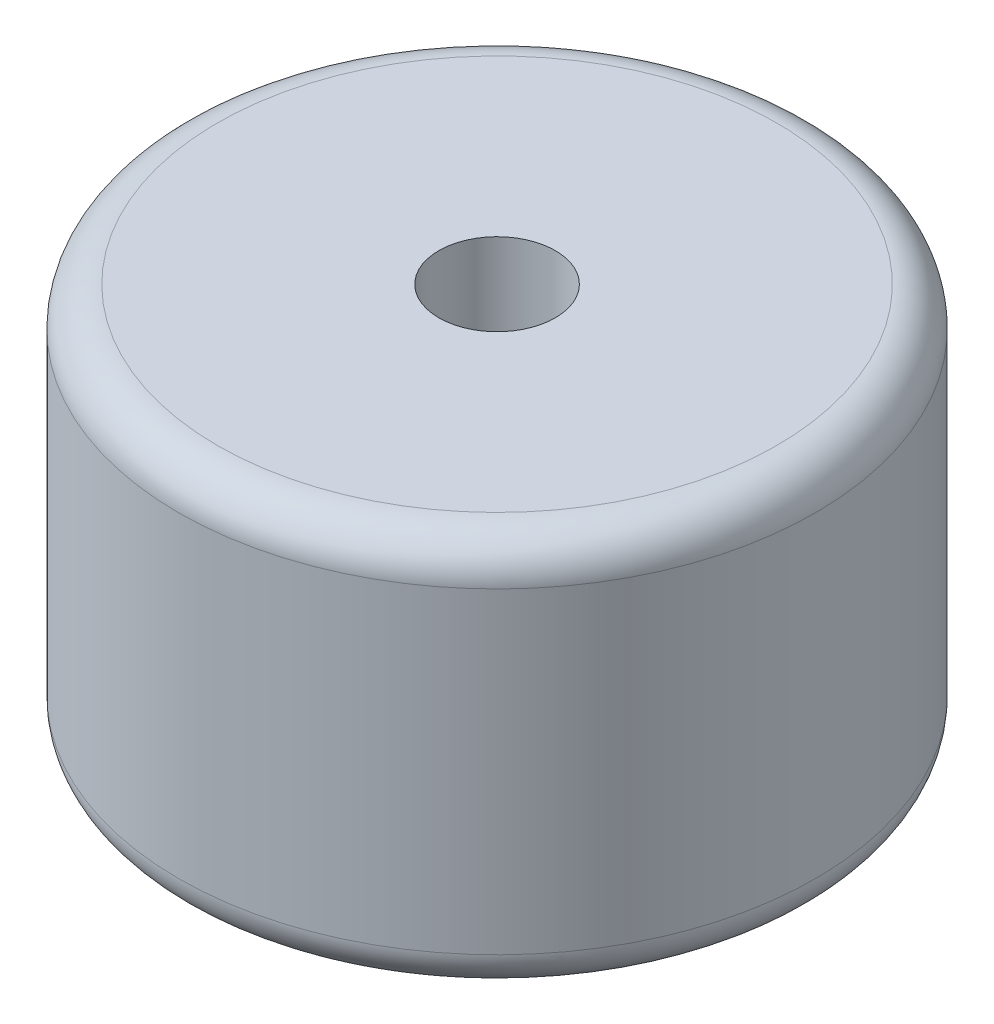
ISO-10303-21;
HEADER;
FILE_DESCRIPTION(('STEP AP214'),'2;1');
FILE_NAME('part.step','',(''),(''),'','','');
FILE_SCHEMA(('AUTOMOTIVE_DESIGN { 1 0 10303 214 1 1 1 1 }'));
ENDSEC;
DATA;
#1=APPLICATION_CONTEXT('core data for automotive mechanical design processes');
#2=APPLICATION_PROTOCOL_DEFINITION('international standard','automotive_design',2000,#1);
#3=PRODUCT_CONTEXT('',#1,'mechanical');
#4=PRODUCT('Part','Part','',(#3));
#5=PRODUCT_RELATED_PRODUCT_CATEGORY('part','',(#4));
#6=PRODUCT_DEFINITION_FORMATION('','',#4);
#7=PRODUCT_DEFINITION_CONTEXT('part definition',#1,'design');
#8=PRODUCT_DEFINITION('design','',#6,#7);
#9=PRODUCT_DEFINITION_SHAPE('','',#8);
#10=(LENGTH_UNIT() NAMED_UNIT(*) SI_UNIT(.MILLI.,.METRE.));
#11=(NAMED_UNIT(*) PLANE_ANGLE_UNIT() SI_UNIT($,.RADIAN.));
#12=(NAMED_UNIT(*) SI_UNIT($,.STERADIAN.) SOLID_ANGLE_UNIT());
#13=UNCERTAINTY_MEASURE_WITH_UNIT(LENGTH_MEASURE(1.E-05),#10,'distance_accuracy_value','');
#14=(GEOMETRIC_REPRESENTATION_CONTEXT(3) GLOBAL_UNCERTAINTY_ASSIGNED_CONTEXT((#13)) GLOBAL_UNIT_ASSIGNED_CONTEXT((#10,
#11,#12)) REPRESENTATION_CONTEXT('',''));
#15=CARTESIAN_POINT('',(0.,0.,0.));
#16=DIRECTION('',(0.,0.,1.));
#17=DIRECTION('',(1.,0.,0.));
#18=AXIS2_PLACEMENT_3D('',#15,#16,#17);
#19=CARTESIAN_POINT('',(0.,25.4,0.));
#20=DIRECTION('',(0.,-1.,0.));
#21=DIRECTION('',(0.,0.,-1.));
#22=AXIS2_PLACEMENT_3D('',#19,#20,#21);
#23=CYLINDRICAL_SURFACE('',#22,41.);
#24=CARTESIAN_POINT('',(0.,-20.4,0.));
#25=DIRECTION('',(0.,1.,0.));
#26=DIRECTION('',(0.,0.,1.));
#27=AXIS2_PLACEMENT_3D('',#24,#25,#26);
#28=CIRCLE('',#27,41.);
#29=CARTESIAN_POINT('',(0.,-20.4,41.));
#30=VERTEX_POINT('',#29);
#31=EDGE_CURVE('E51',#30,#30,#28,.T.);
#32=ORIENTED_EDGE('',*,*,#31,.T.);
#33=EDGE_LOOP('',(#32));
#34=FACE_BOUND('',#33,.T.);
#35=CARTESIAN_POINT('',(0.,20.4,0.));
#36=DIRECTION('',(0.,1.,0.));
#37=DIRECTION('',(0.,0.,1.));
#38=AXIS2_PLACEMENT_3D('',#35,#36,#37);
#39=CIRCLE('',#38,41.);
#40=CARTESIAN_POINT('',(0.,20.4,41.));
#41=VERTEX_POINT('',#40);
#42=EDGE_CURVE('E56',#41,#41,#39,.F.);
#43=ORIENTED_EDGE('',*,*,#42,.T.);
#44=EDGE_LOOP('',(#43));
#45=FACE_BOUND('',#44,.T.);
#46=ADVANCED_FACE('F38',(#34,#45),#23,.T.);
#47=CARTESIAN_POINT('',(0.,25.4,0.));
#48=DIRECTION('',(0.,1.,0.));
#49=DIRECTION('',(0.,0.,1.));
#50=AXIS2_PLACEMENT_3D('',#47,#48,#49);
#51=PLANE('',#50);
#52=CARTESIAN_POINT('',(0.,25.4,0.));
#53=DIRECTION('',(0.,1.,0.));
#54=DIRECTION('',(0.,0.,1.));
#55=AXIS2_PLACEMENT_3D('',#52,#53,#54);
#56=CIRCLE('',#55,7.5);
#57=CARTESIAN_POINT('',(0.,25.4,7.5));
#58=VERTEX_POINT('',#57);
#59=EDGE_CURVE('E62',#58,#58,#56,.T.);
#60=ORIENTED_EDGE('',*,*,#59,.F.);
#61=EDGE_LOOP('',(#60));
#62=FACE_BOUND('',#61,.T.);
#63=CARTESIAN_POINT('',(0.,25.4,0.));
#64=DIRECTION('',(0.,1.,0.));
#65=DIRECTION('',(0.,0.,1.));
#66=AXIS2_PLACEMENT_3D('',#63,#64,#65);
#67=CIRCLE('',#66,36.);
#68=CARTESIAN_POINT('',(0.,25.4,36.));
#69=VERTEX_POINT('',#68);
#70=EDGE_CURVE('E10',#69,#69,#67,.T.);
#71=ORIENTED_EDGE('',*,*,#70,.T.);
#72=EDGE_LOOP('',(#71));
#73=FACE_BOUND('',#72,.T.);
#74=ADVANCED_FACE('F84',(#62,#73),#51,.T.);
#75=CARTESIAN_POINT('',(0.,-25.4,0.));
#76=DIRECTION('',(0.,1.,0.));
#77=DIRECTION('',(0.,0.,1.));
#78=AXIS2_PLACEMENT_3D('',#75,#76,#77);
#79=PLANE('',#78);
#80=CARTESIAN_POINT('',(0.,-25.4,0.));
#81=DIRECTION('',(0.,1.,0.));
#82=DIRECTION('',(0.,0.,1.));
#83=AXIS2_PLACEMENT_3D('',#80,#81,#82);
#84=CIRCLE('',#83,7.5);
#85=CARTESIAN_POINT('',(0.,-25.4,7.5));
#86=VERTEX_POINT('',#85);
#87=EDGE_CURVE('E66',#86,#86,#84,.T.);
#88=ORIENTED_EDGE('',*,*,#87,.T.);
#89=EDGE_LOOP('',(#88));
#90=FACE_BOUND('',#89,.T.);
#91=CARTESIAN_POINT('',(0.,-25.4,0.));
#92=DIRECTION('',(0.,1.,0.));
#93=DIRECTION('',(0.,0.,1.));
#94=AXIS2_PLACEMENT_3D('',#91,#92,#93);
#95=CIRCLE('',#94,36.);
#96=CARTESIAN_POINT('',(0.,-25.4,36.));
#97=VERTEX_POINT('',#96);
#98=EDGE_CURVE('E46',#97,#97,#95,.F.);
#99=ORIENTED_EDGE('',*,*,#98,.T.);
#100=EDGE_LOOP('',(#99));
#101=FACE_BOUND('',#100,.T.);
#102=ADVANCED_FACE('F71',(#90,#101),#79,.F.);
#103=CARTESIAN_POINT('',(0.,-20.4,0.));
#104=DIRECTION('',(0.,1.,0.));
#105=DIRECTION('',(0.,0.,1.));
#106=AXIS2_PLACEMENT_3D('',#103,#104,#105);
#107=TOROIDAL_SURFACE('',#106,36.,5.);
#108=ORIENTED_EDGE('',*,*,#98,.F.);
#109=EDGE_LOOP('',(#108));
#110=FACE_BOUND('',#109,.T.);
#111=ORIENTED_EDGE('',*,*,#31,.F.);
#112=EDGE_LOOP('',(#111));
#113=FACE_BOUND('',#112,.T.);
#114=ADVANCED_FACE('F80',(#110,#113),#107,.T.);
#115=CARTESIAN_POINT('',(0.,20.4,0.));
#116=DIRECTION('',(0.,1.,0.));
#117=DIRECTION('',(0.,0.,1.));
#118=AXIS2_PLACEMENT_3D('',#115,#116,#117);
#119=TOROIDAL_SURFACE('',#118,36.,5.);
#120=ORIENTED_EDGE('',*,*,#42,.F.);
#121=EDGE_LOOP('',(#120));
#122=FACE_BOUND('',#121,.T.);
#123=ORIENTED_EDGE('',*,*,#70,.F.);
#124=EDGE_LOOP('',(#123));
#125=FACE_BOUND('',#124,.T.);
#126=ADVANCED_FACE('F40',(#122,#125),#119,.T.);
#127=CARTESIAN_POINT('',(0.,-25.4,0.));
#128=DIRECTION('',(0.,1.,0.));
#129=DIRECTION('',(0.,0.,1.));
#130=AXIS2_PLACEMENT_3D('',#127,#128,#129);
#131=CYLINDRICAL_SURFACE('',#130,7.5);
#132=ORIENTED_EDGE('',*,*,#59,.T.);
#133=EDGE_LOOP('',(#132));
#134=FACE_BOUND('',#133,.T.);
#135=ORIENTED_EDGE('',*,*,#87,.F.);
#136=EDGE_LOOP('',(#135));
#137=FACE_BOUND('',#136,.T.);
#138=ADVANCED_FACE('F73',(#134,#137),#131,.F.);
#139=CLOSED_SHELL('',(#46,#74,#102,#114,#126,#138));
#140=MANIFOLD_SOLID_BREP('B2',#139);
#141=ADVANCED_BREP_SHAPE_REPRESENTATION('',(#18,#140),#14);
#142=SHAPE_DEFINITION_REPRESENTATION(#9,#141);
ENDSEC;
END-ISO-10303-21;
